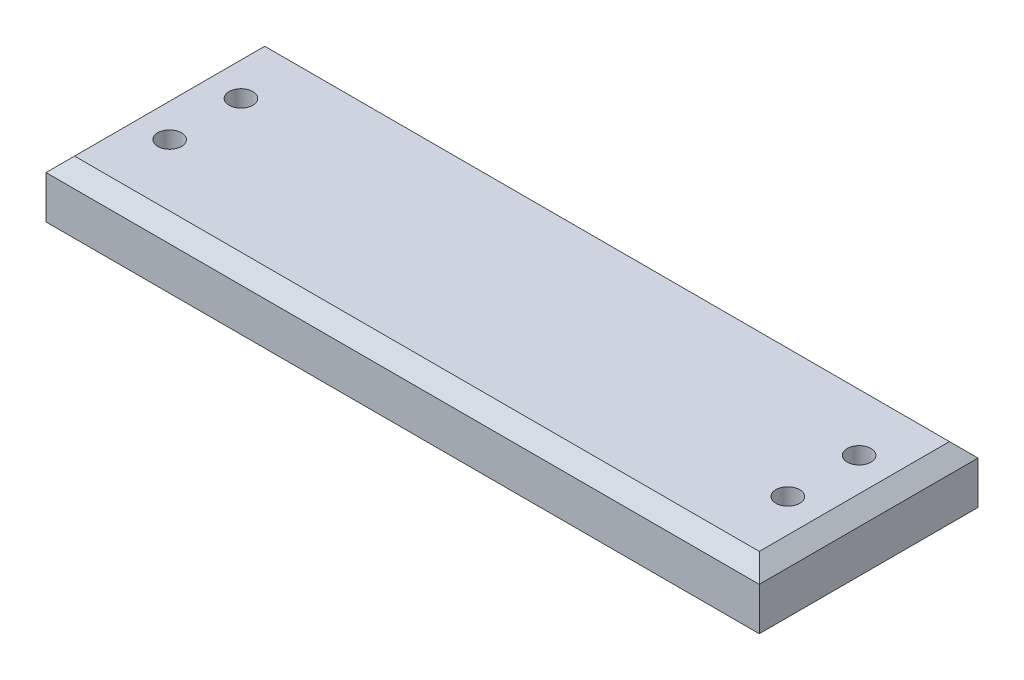
ISO-10303-21;
HEADER;
FILE_DESCRIPTION(('STEP AP214'),'2;1');
FILE_NAME('part.step','',(''),(''),'','','');
FILE_SCHEMA(('AUTOMOTIVE_DESIGN { 1 0 10303 214 1 1 1 1 }'));
ENDSEC;
DATA;
#1=APPLICATION_CONTEXT('core data for automotive mechanical design processes');
#2=APPLICATION_PROTOCOL_DEFINITION('international standard','automotive_design',2000,#1);
#3=PRODUCT_CONTEXT('',#1,'mechanical');
#4=PRODUCT('Part','Part','',(#3));
#5=PRODUCT_RELATED_PRODUCT_CATEGORY('part','',(#4));
#6=PRODUCT_DEFINITION_FORMATION('','',#4);
#7=PRODUCT_DEFINITION_CONTEXT('part definition',#1,'design');
#8=PRODUCT_DEFINITION('design','',#6,#7);
#9=PRODUCT_DEFINITION_SHAPE('','',#8);
#10=(LENGTH_UNIT() NAMED_UNIT(*) SI_UNIT(.MILLI.,.METRE.));
#11=(NAMED_UNIT(*) PLANE_ANGLE_UNIT() SI_UNIT($,.RADIAN.));
#12=(NAMED_UNIT(*) SI_UNIT($,.STERADIAN.) SOLID_ANGLE_UNIT());
#13=UNCERTAINTY_MEASURE_WITH_UNIT(LENGTH_MEASURE(1.E-05),#10,'distance_accuracy_value','');
#14=(GEOMETRIC_REPRESENTATION_CONTEXT(3) GLOBAL_UNCERTAINTY_ASSIGNED_CONTEXT((#13)) GLOBAL_UNIT_ASSIGNED_CONTEXT((#10,
#11,#12)) REPRESENTATION_CONTEXT('',''));
#15=CARTESIAN_POINT('',(0.,0.,0.));
#16=DIRECTION('',(0.,0.,1.));
#17=DIRECTION('',(1.,0.,0.));
#18=AXIS2_PLACEMENT_3D('',#15,#16,#17);
#19=CARTESIAN_POINT('',(75.,6.,-23.));
#20=DIRECTION('',(-1.,0.,0.));
#21=DIRECTION('',(0.,0.,1.));
#22=AXIS2_PLACEMENT_3D('',#19,#20,#21);
#23=PLANE('',#22);
#24=DIRECTION('',(0.,-1.,0.));
#25=VECTOR('',#24,1.);
#26=CARTESIAN_POINT('',(75.,6.,-23.));
#27=LINE('',#26,#25);
#28=CARTESIAN_POINT('',(75.,2.99999999999996,-23.));
#29=VERTEX_POINT('',#28);
#30=CARTESIAN_POINT('',(75.,-6.,-23.));
#31=VERTEX_POINT('',#30);
#32=EDGE_CURVE('E94',#29,#31,#27,.T.);
#33=ORIENTED_EDGE('',*,*,#32,.F.);
#34=DIRECTION('',(0.,0.,1.));
#35=VECTOR('',#34,1.);
#36=CARTESIAN_POINT('',(75.,2.99999999999996,-23.));
#37=LINE('',#36,#35);
#38=CARTESIAN_POINT('',(75.,2.99999999999996,23.));
#39=VERTEX_POINT('',#38);
#40=EDGE_CURVE('E145',#29,#39,#37,.T.);
#41=ORIENTED_EDGE('',*,*,#40,.T.);
#42=DIRECTION('',(0.,-1.,0.));
#43=VECTOR('',#42,1.);
#44=CARTESIAN_POINT('',(75.,6.,23.));
#45=LINE('',#44,#43);
#46=CARTESIAN_POINT('',(75.,-6.,23.));
#47=VERTEX_POINT('',#46);
#48=EDGE_CURVE('E114',#39,#47,#45,.T.);
#49=ORIENTED_EDGE('',*,*,#48,.T.);
#50=DIRECTION('',(0.,0.,-1.));
#51=VECTOR('',#50,1.);
#52=CARTESIAN_POINT('',(75.,-6.,-23.));
#53=LINE('',#52,#51);
#54=EDGE_CURVE('E109',#47,#31,#53,.T.);
#55=ORIENTED_EDGE('',*,*,#54,.T.);
#56=EDGE_LOOP('',(#33,#41,#49,#55));
#57=FACE_BOUND('',#56,.T.);
#58=ADVANCED_FACE('F41',(#57),#23,.F.);
#59=CARTESIAN_POINT('',(75.,6.,-23.));
#60=DIRECTION('',(0.,0.,1.));
#61=DIRECTION('',(1.,0.,0.));
#62=AXIS2_PLACEMENT_3D('',#59,#60,#61);
#63=PLANE('',#62);
#64=DIRECTION('',(0.,-1.,0.));
#65=VECTOR('',#64,1.);
#66=CARTESIAN_POINT('',(-75.,6.,-23.));
#67=LINE('',#66,#65);
#68=CARTESIAN_POINT('',(-75.,2.99999999999996,-23.));
#69=VERTEX_POINT('',#68);
#70=CARTESIAN_POINT('',(-75.,-6.,-23.));
#71=VERTEX_POINT('',#70);
#72=EDGE_CURVE('E103',#69,#71,#67,.T.);
#73=ORIENTED_EDGE('',*,*,#72,.F.);
#74=DIRECTION('',(1.,0.,0.));
#75=VECTOR('',#74,1.);
#76=CARTESIAN_POINT('',(75.,2.99999999999996,-23.));
#77=LINE('',#76,#75);
#78=EDGE_CURVE('E57',#69,#29,#77,.T.);
#79=ORIENTED_EDGE('',*,*,#78,.T.);
#80=ORIENTED_EDGE('',*,*,#32,.T.);
#81=DIRECTION('',(-1.,0.,0.));
#82=VECTOR('',#81,1.);
#83=CARTESIAN_POINT('',(75.,-6.,-23.));
#84=LINE('',#83,#82);
#85=EDGE_CURVE('E97',#31,#71,#84,.T.);
#86=ORIENTED_EDGE('',*,*,#85,.T.);
#87=EDGE_LOOP('',(#73,#79,#80,#86));
#88=FACE_BOUND('',#87,.T.);
#89=ADVANCED_FACE('F96',(#88),#63,.F.);
#90=CARTESIAN_POINT('',(-75.,6.,-23.));
#91=DIRECTION('',(1.,0.,0.));
#92=DIRECTION('',(0.,0.,-1.));
#93=AXIS2_PLACEMENT_3D('',#90,#91,#92);
#94=PLANE('',#93);
#95=DIRECTION('',(0.,-1.,0.));
#96=VECTOR('',#95,1.);
#97=CARTESIAN_POINT('',(-75.,6.,23.));
#98=LINE('',#97,#96);
#99=CARTESIAN_POINT('',(-75.,2.99999999999996,23.));
#100=VERTEX_POINT('',#99);
#101=CARTESIAN_POINT('',(-75.,-6.,23.));
#102=VERTEX_POINT('',#101);
#103=EDGE_CURVE('E129',#100,#102,#98,.T.);
#104=ORIENTED_EDGE('',*,*,#103,.F.);
#105=DIRECTION('',(0.,0.,-1.));
#106=VECTOR('',#105,1.);
#107=CARTESIAN_POINT('',(-75.,2.99999999999996,-23.));
#108=LINE('',#107,#106);
#109=EDGE_CURVE('E65',#100,#69,#108,.T.);
#110=ORIENTED_EDGE('',*,*,#109,.T.);
#111=ORIENTED_EDGE('',*,*,#72,.T.);
#112=DIRECTION('',(0.,0.,1.));
#113=VECTOR('',#112,1.);
#114=CARTESIAN_POINT('',(-75.,-6.,-23.));
#115=LINE('',#114,#113);
#116=EDGE_CURVE('E111',#71,#102,#115,.T.);
#117=ORIENTED_EDGE('',*,*,#116,.T.);
#118=EDGE_LOOP('',(#104,#110,#111,#117));
#119=FACE_BOUND('',#118,.T.);
#120=ADVANCED_FACE('F200',(#119),#94,.F.);
#121=CARTESIAN_POINT('',(75.,6.,23.));
#122=DIRECTION('',(0.,0.,-1.));
#123=DIRECTION('',(-1.,0.,0.));
#124=AXIS2_PLACEMENT_3D('',#121,#122,#123);
#125=PLANE('',#124);
#126=ORIENTED_EDGE('',*,*,#48,.F.);
#127=DIRECTION('',(-1.,0.,0.));
#128=VECTOR('',#127,1.);
#129=CARTESIAN_POINT('',(75.,2.99999999999996,23.));
#130=LINE('',#129,#128);
#131=EDGE_CURVE('E140',#39,#100,#130,.T.);
#132=ORIENTED_EDGE('',*,*,#131,.T.);
#133=ORIENTED_EDGE('',*,*,#103,.T.);
#134=DIRECTION('',(1.,0.,0.));
#135=VECTOR('',#134,1.);
#136=CARTESIAN_POINT('',(75.,-6.,23.));
#137=LINE('',#136,#135);
#138=EDGE_CURVE('E126',#102,#47,#137,.T.);
#139=ORIENTED_EDGE('',*,*,#138,.T.);
#140=EDGE_LOOP('',(#126,#132,#133,#139));
#141=FACE_BOUND('',#140,.T.);
#142=ADVANCED_FACE('F276',(#141),#125,.F.);
#143=CARTESIAN_POINT('',(0.,6.,0.));
#144=DIRECTION('',(0.,-1.,0.));
#145=DIRECTION('',(0.,0.,-1.));
#146=AXIS2_PLACEMENT_3D('',#143,#144,#145);
#147=PLANE('',#146);
#148=CARTESIAN_POINT('',(-65.,6.,7.00000000000001));
#149=DIRECTION('',(0.,1.,0.));
#150=DIRECTION('',(0.,0.,1.));
#151=AXIS2_PLACEMENT_3D('',#148,#149,#150);
#152=CIRCLE('',#151,2.50000000000001);
#153=CARTESIAN_POINT('',(-65.,6.,9.50000000000002));
#154=VERTEX_POINT('',#153);
#155=EDGE_CURVE('E263',#154,#154,#152,.T.);
#156=ORIENTED_EDGE('',*,*,#155,.F.);
#157=EDGE_LOOP('',(#156));
#158=FACE_BOUND('',#157,.T.);
#159=CARTESIAN_POINT('',(65.,6.,-8.));
#160=DIRECTION('',(0.,1.,0.));
#161=DIRECTION('',(0.,0.,1.));
#162=AXIS2_PLACEMENT_3D('',#159,#160,#161);
#163=CIRCLE('',#162,2.5);
#164=CARTESIAN_POINT('',(65.,6.,-5.50000000000001));
#165=VERTEX_POINT('',#164);
#166=EDGE_CURVE('E265',#165,#165,#163,.T.);
#167=ORIENTED_EDGE('',*,*,#166,.F.);
#168=EDGE_LOOP('',(#167));
#169=FACE_BOUND('',#168,.T.);
#170=CARTESIAN_POINT('',(65.,6.,6.99999999999999));
#171=DIRECTION('',(0.,1.,0.));
#172=DIRECTION('',(0.,0.,1.));
#173=AXIS2_PLACEMENT_3D('',#170,#171,#172);
#174=CIRCLE('',#173,2.50000000000001);
#175=CARTESIAN_POINT('',(65.,6.,9.5));
#176=VERTEX_POINT('',#175);
#177=EDGE_CURVE('E270',#176,#176,#174,.T.);
#178=ORIENTED_EDGE('',*,*,#177,.F.);
#179=EDGE_LOOP('',(#178));
#180=FACE_BOUND('',#179,.T.);
#181=CARTESIAN_POINT('',(-65.,6.,-8.));
#182=DIRECTION('',(0.,1.,0.));
#183=DIRECTION('',(0.,0.,1.));
#184=AXIS2_PLACEMENT_3D('',#181,#182,#183);
#185=CIRCLE('',#184,2.5);
#186=CARTESIAN_POINT('',(-65.,6.,-5.50000000000001));
#187=VERTEX_POINT('',#186);
#188=EDGE_CURVE('E122',#187,#187,#185,.T.);
#189=ORIENTED_EDGE('',*,*,#188,.F.);
#190=EDGE_LOOP('',(#189));
#191=FACE_BOUND('',#190,.T.);
#192=DIRECTION('',(0.,0.,1.));
#193=VECTOR('',#192,1.);
#194=CARTESIAN_POINT('',(-72.,6.,0.));
#195=LINE('',#194,#193);
#196=CARTESIAN_POINT('',(-72.,6.,-20.));
#197=VERTEX_POINT('',#196);
#198=CARTESIAN_POINT('',(-72.,6.,20.));
#199=VERTEX_POINT('',#198);
#200=EDGE_CURVE('E135',#197,#199,#195,.T.);
#201=ORIENTED_EDGE('',*,*,#200,.T.);
#202=DIRECTION('',(1.,0.,0.));
#203=VECTOR('',#202,1.);
#204=CARTESIAN_POINT('',(0.,6.,20.));
#205=LINE('',#204,#203);
#206=CARTESIAN_POINT('',(72.,6.,20.));
#207=VERTEX_POINT('',#206);
#208=EDGE_CURVE('E137',#199,#207,#205,.T.);
#209=ORIENTED_EDGE('',*,*,#208,.T.);
#210=DIRECTION('',(0.,0.,-1.));
#211=VECTOR('',#210,1.);
#212=CARTESIAN_POINT('',(72.,6.,0.));
#213=LINE('',#212,#211);
#214=CARTESIAN_POINT('',(72.,6.,-20.));
#215=VERTEX_POINT('',#214);
#216=EDGE_CURVE('E102',#207,#215,#213,.T.);
#217=ORIENTED_EDGE('',*,*,#216,.T.);
#218=DIRECTION('',(-1.,0.,0.));
#219=VECTOR('',#218,1.);
#220=CARTESIAN_POINT('',(0.,6.,-20.));
#221=LINE('',#220,#219);
#222=EDGE_CURVE('E133',#215,#197,#221,.T.);
#223=ORIENTED_EDGE('',*,*,#222,.T.);
#224=EDGE_LOOP('',(#201,#209,#217,#223));
#225=FACE_BOUND('',#224,.T.);
#226=ADVANCED_FACE('F185',(#158,#169,#180,#191,#225),#147,.F.);
#227=CARTESIAN_POINT('',(0.,-6.,0.));
#228=DIRECTION('',(0.,-1.,0.));
#229=DIRECTION('',(0.,0.,-1.));
#230=AXIS2_PLACEMENT_3D('',#227,#228,#229);
#231=PLANE('',#230);
#232=CARTESIAN_POINT('',(-65.,-6.,7.00000000000001));
#233=DIRECTION('',(0.,-1.,0.));
#234=DIRECTION('',(0.,0.,-1.));
#235=AXIS2_PLACEMENT_3D('',#232,#233,#234);
#236=CIRCLE('',#235,3.99999999999999);
#237=CARTESIAN_POINT('',(-65.,-6.,3.00000000000002));
#238=VERTEX_POINT('',#237);
#239=EDGE_CURVE('E162',#238,#238,#236,.F.);
#240=ORIENTED_EDGE('',*,*,#239,.T.);
#241=EDGE_LOOP('',(#240));
#242=FACE_BOUND('',#241,.T.);
#243=CARTESIAN_POINT('',(-65.,-6.,-8.));
#244=DIRECTION('',(0.,-1.,0.));
#245=DIRECTION('',(0.,0.,-1.));
#246=AXIS2_PLACEMENT_3D('',#243,#244,#245);
#247=CIRCLE('',#246,3.99999999999999);
#248=CARTESIAN_POINT('',(-65.,-6.,-12.));
#249=VERTEX_POINT('',#248);
#250=EDGE_CURVE('E159',#249,#249,#247,.F.);
#251=ORIENTED_EDGE('',*,*,#250,.T.);
#252=EDGE_LOOP('',(#251));
#253=FACE_BOUND('',#252,.T.);
#254=CARTESIAN_POINT('',(65.,-6.,6.99999999999999));
#255=DIRECTION('',(0.,-1.,0.));
#256=DIRECTION('',(0.,0.,-1.));
#257=AXIS2_PLACEMENT_3D('',#254,#255,#256);
#258=CIRCLE('',#257,3.99999999999999);
#259=CARTESIAN_POINT('',(65.,-6.,3.));
#260=VERTEX_POINT('',#259);
#261=EDGE_CURVE('E156',#260,#260,#258,.F.);
#262=ORIENTED_EDGE('',*,*,#261,.T.);
#263=EDGE_LOOP('',(#262));
#264=FACE_BOUND('',#263,.T.);
#265=CARTESIAN_POINT('',(65.,-6.,-8.));
#266=DIRECTION('',(0.,-1.,0.));
#267=DIRECTION('',(0.,0.,-1.));
#268=AXIS2_PLACEMENT_3D('',#265,#266,#267);
#269=CIRCLE('',#268,3.99999999999999);
#270=CARTESIAN_POINT('',(65.,-6.,-12.));
#271=VERTEX_POINT('',#270);
#272=EDGE_CURVE('E147',#271,#271,#269,.F.);
#273=ORIENTED_EDGE('',*,*,#272,.T.);
#274=EDGE_LOOP('',(#273));
#275=FACE_BOUND('',#274,.T.);
#276=ORIENTED_EDGE('',*,*,#54,.F.);
#277=ORIENTED_EDGE('',*,*,#138,.F.);
#278=ORIENTED_EDGE('',*,*,#116,.F.);
#279=ORIENTED_EDGE('',*,*,#85,.F.);
#280=EDGE_LOOP('',(#276,#277,#278,#279));
#281=FACE_BOUND('',#280,.T.);
#282=ADVANCED_FACE('F107',(#242,#253,#264,#275,#281),#231,.T.);
#283=CARTESIAN_POINT('',(0.,6.,-20.));
#284=DIRECTION('',(0.,-0.707106781186544,0.707106781186551));
#285=DIRECTION('',(-1.,0.,0.));
#286=AXIS2_PLACEMENT_3D('',#283,#284,#285);
#287=PLANE('',#286);
#288=DIRECTION('',(-0.577350269189624,0.577350269189629,0.577350269189624));
#289=VECTOR('',#288,1.);
#290=CARTESIAN_POINT('',(65.3333333333334,12.6666666666667,-13.3333333333334));
#291=LINE('',#290,#289);
#292=EDGE_CURVE('E119',#29,#215,#291,.T.);
#293=ORIENTED_EDGE('',*,*,#292,.F.);
#294=ORIENTED_EDGE('',*,*,#78,.F.);
#295=DIRECTION('',(0.577350269189624,0.577350269189629,0.577350269189624));
#296=VECTOR('',#295,1.);
#297=CARTESIAN_POINT('',(-48.0000000000001,30.0000000000001,3.99999999999986));
#298=LINE('',#297,#296);
#299=EDGE_CURVE('E116',#197,#69,#298,.F.);
#300=ORIENTED_EDGE('',*,*,#299,.F.);
#301=ORIENTED_EDGE('',*,*,#222,.F.);
#302=EDGE_LOOP('',(#293,#294,#300,#301));
#303=FACE_BOUND('',#302,.T.);
#304=ADVANCED_FACE('F184',(#303),#287,.F.);
#305=CARTESIAN_POINT('',(-72.,6.,0.));
#306=DIRECTION('',(0.707106781186551,-0.707106781186544,0.));
#307=DIRECTION('',(0.,0.,1.));
#308=AXIS2_PLACEMENT_3D('',#305,#306,#307);
#309=PLANE('',#308);
#310=ORIENTED_EDGE('',*,*,#299,.T.);
#311=ORIENTED_EDGE('',*,*,#109,.F.);
#312=DIRECTION('',(0.577350269189624,0.577350269189629,-0.577350269189624));
#313=VECTOR('',#312,1.);
#314=CARTESIAN_POINT('',(-65.3333333333334,12.6666666666667,13.3333333333334));
#315=LINE('',#314,#313);
#316=EDGE_CURVE('E150',#199,#100,#315,.F.);
#317=ORIENTED_EDGE('',*,*,#316,.F.);
#318=ORIENTED_EDGE('',*,*,#200,.F.);
#319=EDGE_LOOP('',(#310,#311,#317,#318));
#320=FACE_BOUND('',#319,.T.);
#321=ADVANCED_FACE('F220',(#320),#309,.F.);
#322=CARTESIAN_POINT('',(72.,6.,0.));
#323=DIRECTION('',(-0.707106781186551,-0.707106781186544,0.));
#324=DIRECTION('',(0.,0.,-1.));
#325=AXIS2_PLACEMENT_3D('',#322,#323,#324);
#326=PLANE('',#325);
#327=ORIENTED_EDGE('',*,*,#292,.T.);
#328=ORIENTED_EDGE('',*,*,#216,.F.);
#329=DIRECTION('',(0.577350269189624,-0.577350269189629,0.577350269189624));
#330=VECTOR('',#329,1.);
#331=CARTESIAN_POINT('',(65.3333333333334,12.6666666666667,13.3333333333334));
#332=LINE('',#331,#330);
#333=EDGE_CURVE('E148',#39,#207,#332,.F.);
#334=ORIENTED_EDGE('',*,*,#333,.F.);
#335=ORIENTED_EDGE('',*,*,#40,.F.);
#336=EDGE_LOOP('',(#327,#328,#334,#335));
#337=FACE_BOUND('',#336,.T.);
#338=ADVANCED_FACE('F213',(#337),#326,.F.);
#339=CARTESIAN_POINT('',(0.,6.,20.));
#340=DIRECTION('',(0.,-0.707106781186544,-0.707106781186551));
#341=DIRECTION('',(1.,0.,0.));
#342=AXIS2_PLACEMENT_3D('',#339,#340,#341);
#343=PLANE('',#342);
#344=ORIENTED_EDGE('',*,*,#316,.T.);
#345=ORIENTED_EDGE('',*,*,#131,.F.);
#346=ORIENTED_EDGE('',*,*,#333,.T.);
#347=ORIENTED_EDGE('',*,*,#208,.F.);
#348=EDGE_LOOP('',(#344,#345,#346,#347));
#349=FACE_BOUND('',#348,.T.);
#350=ADVANCED_FACE('F205',(#349),#343,.F.);
#351=CARTESIAN_POINT('',(-65.,-6.,-8.));
#352=DIRECTION('',(0.,1.,0.));
#353=DIRECTION('',(0.,0.,1.));
#354=AXIS2_PLACEMENT_3D('',#351,#352,#353);
#355=CYLINDRICAL_SURFACE('',#354,2.5);
#356=CARTESIAN_POINT('',(-65.,-4.49999999999999,-8.));
#357=DIRECTION('',(0.,-1.,0.));
#358=DIRECTION('',(0.,0.,-1.));
#359=AXIS2_PLACEMENT_3D('',#356,#357,#358);
#360=CIRCLE('',#359,2.5);
#361=CARTESIAN_POINT('',(-65.,-4.49999999999999,-10.5));
#362=VERTEX_POINT('',#361);
#363=EDGE_CURVE('E168',#362,#362,#360,.T.);
#364=ORIENTED_EDGE('',*,*,#363,.T.);
#365=EDGE_LOOP('',(#364));
#366=FACE_BOUND('',#365,.T.);
#367=ORIENTED_EDGE('',*,*,#188,.T.);
#368=EDGE_LOOP('',(#367));
#369=FACE_BOUND('',#368,.T.);
#370=ADVANCED_FACE('F212',(#366,#369),#355,.F.);
#371=CARTESIAN_POINT('',(65.,-6.,6.99999999999999));
#372=DIRECTION('',(0.,1.,0.));
#373=DIRECTION('',(0.,0.,1.));
#374=AXIS2_PLACEMENT_3D('',#371,#372,#373);
#375=CYLINDRICAL_SURFACE('',#374,2.50000000000001);
#376=CARTESIAN_POINT('',(65.,-4.5,6.99999999999999));
#377=DIRECTION('',(0.,-1.,0.));
#378=DIRECTION('',(0.,0.,-1.));
#379=AXIS2_PLACEMENT_3D('',#376,#377,#378);
#380=CIRCLE('',#379,2.50000000000001);
#381=CARTESIAN_POINT('',(65.,-4.5,4.49999999999998));
#382=VERTEX_POINT('',#381);
#383=EDGE_CURVE('E50',#382,#382,#380,.T.);
#384=ORIENTED_EDGE('',*,*,#383,.T.);
#385=EDGE_LOOP('',(#384));
#386=FACE_BOUND('',#385,.T.);
#387=ORIENTED_EDGE('',*,*,#177,.T.);
#388=EDGE_LOOP('',(#387));
#389=FACE_BOUND('',#388,.T.);
#390=ADVANCED_FACE('F173',(#386,#389),#375,.F.);
#391=CARTESIAN_POINT('',(65.,-6.,-8.));
#392=DIRECTION('',(0.,1.,0.));
#393=DIRECTION('',(0.,0.,1.));
#394=AXIS2_PLACEMENT_3D('',#391,#392,#393);
#395=CYLINDRICAL_SURFACE('',#394,2.5);
#396=CARTESIAN_POINT('',(65.,-4.49999999999999,-8.));
#397=DIRECTION('',(0.,-1.,0.));
#398=DIRECTION('',(0.,0.,-1.));
#399=AXIS2_PLACEMENT_3D('',#396,#397,#398);
#400=CIRCLE('',#399,2.5);
#401=CARTESIAN_POINT('',(65.,-4.49999999999999,-10.5));
#402=VERTEX_POINT('',#401);
#403=EDGE_CURVE('E11',#402,#402,#400,.T.);
#404=ORIENTED_EDGE('',*,*,#403,.T.);
#405=EDGE_LOOP('',(#404));
#406=FACE_BOUND('',#405,.T.);
#407=ORIENTED_EDGE('',*,*,#166,.T.);
#408=EDGE_LOOP('',(#407));
#409=FACE_BOUND('',#408,.T.);
#410=ADVANCED_FACE('F296',(#406,#409),#395,.F.);
#411=CARTESIAN_POINT('',(-65.,-6.,7.00000000000001));
#412=DIRECTION('',(0.,1.,0.));
#413=DIRECTION('',(0.,0.,1.));
#414=AXIS2_PLACEMENT_3D('',#411,#412,#413);
#415=CYLINDRICAL_SURFACE('',#414,2.50000000000001);
#416=CARTESIAN_POINT('',(-65.,-4.5,7.00000000000001));
#417=DIRECTION('',(0.,-1.,0.));
#418=DIRECTION('',(0.,0.,-1.));
#419=AXIS2_PLACEMENT_3D('',#416,#417,#418);
#420=CIRCLE('',#419,2.50000000000001);
#421=CARTESIAN_POINT('',(-65.,-4.5,4.5));
#422=VERTEX_POINT('',#421);
#423=EDGE_CURVE('E165',#422,#422,#420,.T.);
#424=ORIENTED_EDGE('',*,*,#423,.T.);
#425=EDGE_LOOP('',(#424));
#426=FACE_BOUND('',#425,.T.);
#427=ORIENTED_EDGE('',*,*,#155,.T.);
#428=EDGE_LOOP('',(#427));
#429=FACE_BOUND('',#428,.T.);
#430=ADVANCED_FACE('F239',(#426,#429),#415,.F.);
#431=CARTESIAN_POINT('',(-65.,-6.,7.00000000000001));
#432=DIRECTION('',(0.,-1.,0.));
#433=DIRECTION('',(0.,0.,-1.));
#434=AXIS2_PLACEMENT_3D('',#431,#432,#433);
#435=CONICAL_SURFACE('',#434,3.99999999999999,0.785398163397442);
#436=ORIENTED_EDGE('',*,*,#423,.F.);
#437=EDGE_LOOP('',(#436));
#438=FACE_BOUND('',#437,.T.);
#439=ORIENTED_EDGE('',*,*,#239,.F.);
#440=EDGE_LOOP('',(#439));
#441=FACE_BOUND('',#440,.T.);
#442=ADVANCED_FACE('F233',(#438,#441),#435,.F.);
#443=CARTESIAN_POINT('',(-65.,-6.,-8.));
#444=DIRECTION('',(0.,-1.,0.));
#445=DIRECTION('',(0.,0.,-1.));
#446=AXIS2_PLACEMENT_3D('',#443,#444,#445);
#447=CONICAL_SURFACE('',#446,3.99999999999999,0.785398163397442);
#448=ORIENTED_EDGE('',*,*,#363,.F.);
#449=EDGE_LOOP('',(#448));
#450=FACE_BOUND('',#449,.T.);
#451=ORIENTED_EDGE('',*,*,#250,.F.);
#452=EDGE_LOOP('',(#451));
#453=FACE_BOUND('',#452,.T.);
#454=ADVANCED_FACE('F179',(#450,#453),#447,.F.);
#455=CARTESIAN_POINT('',(65.,-6.,6.99999999999999));
#456=DIRECTION('',(0.,-1.,0.));
#457=DIRECTION('',(0.,0.,-1.));
#458=AXIS2_PLACEMENT_3D('',#455,#456,#457);
#459=CONICAL_SURFACE('',#458,3.99999999999999,0.785398163397442);
#460=ORIENTED_EDGE('',*,*,#383,.F.);
#461=EDGE_LOOP('',(#460));
#462=FACE_BOUND('',#461,.T.);
#463=ORIENTED_EDGE('',*,*,#261,.F.);
#464=EDGE_LOOP('',(#463));
#465=FACE_BOUND('',#464,.T.);
#466=ADVANCED_FACE('F176',(#462,#465),#459,.F.);
#467=CARTESIAN_POINT('',(65.,-6.,-8.));
#468=DIRECTION('',(0.,-1.,0.));
#469=DIRECTION('',(0.,0.,-1.));
#470=AXIS2_PLACEMENT_3D('',#467,#468,#469);
#471=CONICAL_SURFACE('',#470,3.99999999999999,0.785398163397442);
#472=ORIENTED_EDGE('',*,*,#403,.F.);
#473=EDGE_LOOP('',(#472));
#474=FACE_BOUND('',#473,.T.);
#475=ORIENTED_EDGE('',*,*,#272,.F.);
#476=EDGE_LOOP('',(#475));
#477=FACE_BOUND('',#476,.T.);
#478=ADVANCED_FACE('F44',(#474,#477),#471,.F.);
#479=CLOSED_SHELL('',(#58,#89,#120,#142,#226,#282,#304,#321,#338,#350,#370,#390,#410,#430,#442,
#454,#466,#478));
#480=MANIFOLD_SOLID_BREP('B2',#479);
#481=ADVANCED_BREP_SHAPE_REPRESENTATION('',(#18,#480),#14);
#482=SHAPE_DEFINITION_REPRESENTATION(#9,#481);
ENDSEC;
END-ISO-10303-21;
